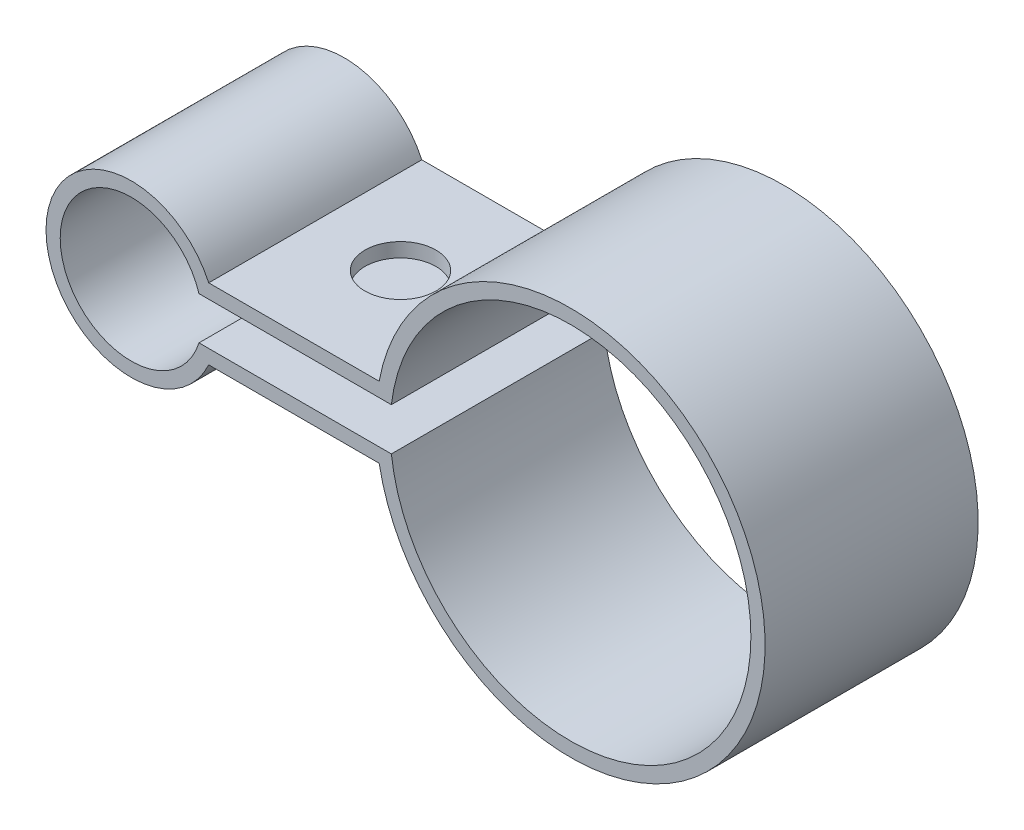
ISO-10303-21;
HEADER;
FILE_DESCRIPTION(('STEP AP214'),'2;1');
FILE_NAME('part.step','',(''),(''),'','','');
FILE_SCHEMA(('AUTOMOTIVE_DESIGN { 1 0 10303 214 1 1 1 1 }'));
ENDSEC;
DATA;
#1=APPLICATION_CONTEXT('core data for automotive mechanical design processes');
#2=APPLICATION_PROTOCOL_DEFINITION('international standard','automotive_design',2000,#1);
#3=PRODUCT_CONTEXT('',#1,'mechanical');
#4=PRODUCT('Part','Part','',(#3));
#5=PRODUCT_RELATED_PRODUCT_CATEGORY('part','',(#4));
#6=PRODUCT_DEFINITION_FORMATION('','',#4);
#7=PRODUCT_DEFINITION_CONTEXT('part definition',#1,'design');
#8=PRODUCT_DEFINITION('design','',#6,#7);
#9=PRODUCT_DEFINITION_SHAPE('','',#8);
#10=(LENGTH_UNIT() NAMED_UNIT(*) SI_UNIT(.MILLI.,.METRE.));
#11=(NAMED_UNIT(*) PLANE_ANGLE_UNIT() SI_UNIT($,.RADIAN.));
#12=(NAMED_UNIT(*) SI_UNIT($,.STERADIAN.) SOLID_ANGLE_UNIT());
#13=UNCERTAINTY_MEASURE_WITH_UNIT(LENGTH_MEASURE(1.E-05),#10,'distance_accuracy_value','');
#14=(GEOMETRIC_REPRESENTATION_CONTEXT(3) GLOBAL_UNCERTAINTY_ASSIGNED_CONTEXT((#13)) GLOBAL_UNIT_ASSIGNED_CONTEXT((#10,
#11,#12)) REPRESENTATION_CONTEXT('',''));
#15=CARTESIAN_POINT('',(0.,0.,0.));
#16=DIRECTION('',(0.,0.,1.));
#17=DIRECTION('',(1.,0.,0.));
#18=AXIS2_PLACEMENT_3D('',#15,#16,#17);
#19=CARTESIAN_POINT('',(0.,0.,15.));
#20=DIRECTION('',(0.,0.,1.));
#21=DIRECTION('',(1.,0.,0.));
#22=AXIS2_PLACEMENT_3D('',#19,#20,#21);
#23=PLANE('',#22);
#24=CARTESIAN_POINT('',(0.,0.,15.));
#25=DIRECTION('',(0.,0.,1.));
#26=DIRECTION('',(1.,0.,0.));
#27=AXIS2_PLACEMENT_3D('',#24,#25,#26);
#28=CIRCLE('',#27,6.);
#29=CARTESIAN_POINT('',(5.45435605731786,2.5,15.));
#30=VERTEX_POINT('',#29);
#31=CARTESIAN_POINT('',(5.45435605731786,-2.5,15.));
#32=VERTEX_POINT('',#31);
#33=EDGE_CURVE('E135',#30,#32,#28,.T.);
#34=ORIENTED_EDGE('',*,*,#33,.T.);
#35=DIRECTION('',(1.,0.,0.));
#36=VECTOR('',#35,1.);
#37=CARTESIAN_POINT('',(5.45435605731786,-2.5,15.));
#38=LINE('',#37,#36);
#39=CARTESIAN_POINT('',(17.4543560573179,-2.5,15.));
#40=VERTEX_POINT('',#39);
#41=EDGE_CURVE('E138',#32,#40,#38,.T.);
#42=ORIENTED_EDGE('',*,*,#41,.T.);
#43=CARTESIAN_POINT('',(30.924322649704,0.,15.));
#44=DIRECTION('',(0.,0.,1.));
#45=DIRECTION('',(1.,0.,0.));
#46=AXIS2_PLACEMENT_3D('',#43,#44,#45);
#47=CIRCLE('',#46,13.7);
#48=CARTESIAN_POINT('',(17.4543560573179,2.5,15.));
#49=VERTEX_POINT('',#48);
#50=EDGE_CURVE('E141',#40,#49,#47,.T.);
#51=ORIENTED_EDGE('',*,*,#50,.T.);
#52=DIRECTION('',(-1.,0.,0.));
#53=VECTOR('',#52,1.);
#54=CARTESIAN_POINT('',(5.45435605731786,2.5,15.));
#55=LINE('',#54,#53);
#56=EDGE_CURVE('E143',#49,#30,#55,.T.);
#57=ORIENTED_EDGE('',*,*,#56,.T.);
#58=EDGE_LOOP('',(#34,#42,#51,#57));
#59=FACE_BOUND('',#58,.T.);
#60=DIRECTION('',(-1.,0.,0.));
#61=VECTOR('',#60,1.);
#62=CARTESIAN_POINT('',(4.76969600708473,1.5,15.));
#63=LINE('',#62,#61);
#64=CARTESIAN_POINT('',(18.3132164333565,1.5,15.));
#65=VERTEX_POINT('',#64);
#66=CARTESIAN_POINT('',(4.76969600708473,1.5,15.));
#67=VERTEX_POINT('',#66);
#68=EDGE_CURVE('E115',#65,#67,#63,.T.);
#69=ORIENTED_EDGE('',*,*,#68,.F.);
#70=CARTESIAN_POINT('',(30.924322649704,0.,15.));
#71=DIRECTION('',(0.,0.,1.));
#72=DIRECTION('',(1.,0.,0.));
#73=AXIS2_PLACEMENT_3D('',#70,#71,#72);
#74=CIRCLE('',#73,12.7);
#75=CARTESIAN_POINT('',(18.3132164333565,-1.5,15.));
#76=VERTEX_POINT('',#75);
#77=EDGE_CURVE('E106',#76,#65,#74,.T.);
#78=ORIENTED_EDGE('',*,*,#77,.F.);
#79=DIRECTION('',(1.,0.,0.));
#80=VECTOR('',#79,1.);
#81=CARTESIAN_POINT('',(9.54145622022061,-1.5,15.));
#82=LINE('',#81,#80);
#83=CARTESIAN_POINT('',(4.76969600708473,-1.5,15.));
#84=VERTEX_POINT('',#83);
#85=EDGE_CURVE('E99',#84,#76,#82,.T.);
#86=ORIENTED_EDGE('',*,*,#85,.F.);
#87=CARTESIAN_POINT('',(0.,0.,15.));
#88=DIRECTION('',(0.,0.,1.));
#89=DIRECTION('',(1.,0.,0.));
#90=AXIS2_PLACEMENT_3D('',#87,#88,#89);
#91=CIRCLE('',#90,5.);
#92=EDGE_CURVE('E117',#67,#84,#91,.T.);
#93=ORIENTED_EDGE('',*,*,#92,.F.);
#94=EDGE_LOOP('',(#69,#78,#86,#93));
#95=FACE_BOUND('',#94,.T.);
#96=ADVANCED_FACE('F34',(#59,#95),#23,.T.);
#97=CARTESIAN_POINT('',(0.,0.,0.));
#98=DIRECTION('',(0.,0.,1.));
#99=DIRECTION('',(1.,0.,0.));
#100=AXIS2_PLACEMENT_3D('',#97,#98,#99);
#101=PLANE('',#100);
#102=CARTESIAN_POINT('',(0.,0.,0.));
#103=DIRECTION('',(0.,0.,1.));
#104=DIRECTION('',(1.,0.,0.));
#105=AXIS2_PLACEMENT_3D('',#102,#103,#104);
#106=CIRCLE('',#105,6.);
#107=CARTESIAN_POINT('',(5.45435605731786,2.5,0.));
#108=VERTEX_POINT('',#107);
#109=CARTESIAN_POINT('',(5.45435605731786,-2.5,0.));
#110=VERTEX_POINT('',#109);
#111=EDGE_CURVE('E111',#108,#110,#106,.T.);
#112=ORIENTED_EDGE('',*,*,#111,.F.);
#113=DIRECTION('',(-1.,0.,0.));
#114=VECTOR('',#113,1.);
#115=CARTESIAN_POINT('',(5.45435605731786,2.5,0.));
#116=LINE('',#115,#114);
#117=CARTESIAN_POINT('',(17.4543560573179,2.5,0.));
#118=VERTEX_POINT('',#117);
#119=EDGE_CURVE('E139',#118,#108,#116,.T.);
#120=ORIENTED_EDGE('',*,*,#119,.F.);
#121=CARTESIAN_POINT('',(30.924322649704,0.,0.));
#122=DIRECTION('',(0.,0.,1.));
#123=DIRECTION('',(1.,0.,0.));
#124=AXIS2_PLACEMENT_3D('',#121,#122,#123);
#125=CIRCLE('',#124,13.7);
#126=CARTESIAN_POINT('',(17.4543560573179,-2.5,0.));
#127=VERTEX_POINT('',#126);
#128=EDGE_CURVE('E150',#127,#118,#125,.T.);
#129=ORIENTED_EDGE('',*,*,#128,.F.);
#130=DIRECTION('',(1.,0.,0.));
#131=VECTOR('',#130,1.);
#132=CARTESIAN_POINT('',(13.5414562202206,-2.5,0.));
#133=LINE('',#132,#131);
#134=EDGE_CURVE('E148',#110,#127,#133,.T.);
#135=ORIENTED_EDGE('',*,*,#134,.F.);
#136=EDGE_LOOP('',(#112,#120,#129,#135));
#137=FACE_BOUND('',#136,.T.);
#138=CARTESIAN_POINT('',(30.924322649704,0.,0.));
#139=DIRECTION('',(0.,0.,1.));
#140=DIRECTION('',(1.,0.,0.));
#141=AXIS2_PLACEMENT_3D('',#138,#139,#140);
#142=CIRCLE('',#141,12.7);
#143=CARTESIAN_POINT('',(18.3132164333565,-1.5,0.));
#144=VERTEX_POINT('',#143);
#145=CARTESIAN_POINT('',(18.3132164333565,1.5,0.));
#146=VERTEX_POINT('',#145);
#147=EDGE_CURVE('E58',#144,#146,#142,.T.);
#148=ORIENTED_EDGE('',*,*,#147,.T.);
#149=DIRECTION('',(-1.,0.,0.));
#150=VECTOR('',#149,1.);
#151=CARTESIAN_POINT('',(4.76969600708473,1.5,0.));
#152=LINE('',#151,#150);
#153=CARTESIAN_POINT('',(4.76969600708473,1.5,0.));
#154=VERTEX_POINT('',#153);
#155=EDGE_CURVE('E123',#146,#154,#152,.T.);
#156=ORIENTED_EDGE('',*,*,#155,.T.);
#157=CARTESIAN_POINT('',(0.,0.,0.));
#158=DIRECTION('',(0.,0.,1.));
#159=DIRECTION('',(1.,0.,0.));
#160=AXIS2_PLACEMENT_3D('',#157,#158,#159);
#161=CIRCLE('',#160,5.);
#162=CARTESIAN_POINT('',(4.76969600708473,-1.5,0.));
#163=VERTEX_POINT('',#162);
#164=EDGE_CURVE('E127',#154,#163,#161,.T.);
#165=ORIENTED_EDGE('',*,*,#164,.T.);
#166=DIRECTION('',(1.,0.,0.));
#167=VECTOR('',#166,1.);
#168=CARTESIAN_POINT('',(4.76969600708473,-1.5,0.));
#169=LINE('',#168,#167);
#170=EDGE_CURVE('E107',#163,#144,#169,.T.);
#171=ORIENTED_EDGE('',*,*,#170,.T.);
#172=EDGE_LOOP('',(#148,#156,#165,#171));
#173=FACE_BOUND('',#172,.T.);
#174=ADVANCED_FACE('F169',(#137,#173),#101,.F.);
#175=CARTESIAN_POINT('',(0.,0.,15.));
#176=DIRECTION('',(0.,0.,-1.));
#177=DIRECTION('',(-1.,0.,0.));
#178=AXIS2_PLACEMENT_3D('',#175,#176,#177);
#179=CYLINDRICAL_SURFACE('',#178,6.);
#180=ORIENTED_EDGE('',*,*,#111,.T.);
#181=DIRECTION('',(0.,0.,-1.));
#182=VECTOR('',#181,1.);
#183=CARTESIAN_POINT('',(5.45435605731786,-2.5,15.));
#184=LINE('',#183,#182);
#185=EDGE_CURVE('E11',#32,#110,#184,.T.);
#186=ORIENTED_EDGE('',*,*,#185,.F.);
#187=ORIENTED_EDGE('',*,*,#33,.F.);
#188=DIRECTION('',(0.,0.,-1.));
#189=VECTOR('',#188,1.);
#190=CARTESIAN_POINT('',(5.45435605731786,2.5,15.));
#191=LINE('',#190,#189);
#192=EDGE_CURVE('E145',#30,#108,#191,.T.);
#193=ORIENTED_EDGE('',*,*,#192,.T.);
#194=EDGE_LOOP('',(#180,#186,#187,#193));
#195=FACE_BOUND('',#194,.T.);
#196=ADVANCED_FACE('F36',(#195),#179,.T.);
#197=CARTESIAN_POINT('',(13.5414562202206,-2.5,15.));
#198=DIRECTION('',(0.,1.,0.));
#199=DIRECTION('',(0.,0.,1.));
#200=AXIS2_PLACEMENT_3D('',#197,#198,#199);
#201=PLANE('',#200);
#202=CARTESIAN_POINT('',(11.4543560573179,-2.5,7.5));
#203=DIRECTION('',(0.,1.,0.));
#204=DIRECTION('',(0.,0.,1.));
#205=AXIS2_PLACEMENT_3D('',#202,#203,#204);
#206=CIRCLE('',#205,2.5);
#207=CARTESIAN_POINT('',(11.4543560573179,-2.5,10.));
#208=VERTEX_POINT('',#207);
#209=EDGE_CURVE('E124',#208,#208,#206,.T.);
#210=ORIENTED_EDGE('',*,*,#209,.T.);
#211=EDGE_LOOP('',(#210));
#212=FACE_BOUND('',#211,.T.);
#213=ORIENTED_EDGE('',*,*,#134,.T.);
#214=DIRECTION('',(0.,0.,-1.));
#215=VECTOR('',#214,1.);
#216=CARTESIAN_POINT('',(17.4543560573179,-2.5,15.));
#217=LINE('',#216,#215);
#218=EDGE_CURVE('E43',#40,#127,#217,.T.);
#219=ORIENTED_EDGE('',*,*,#218,.F.);
#220=ORIENTED_EDGE('',*,*,#41,.F.);
#221=ORIENTED_EDGE('',*,*,#185,.T.);
#222=EDGE_LOOP('',(#213,#219,#220,#221));
#223=FACE_BOUND('',#222,.T.);
#224=ADVANCED_FACE('F179',(#212,#223),#201,.F.);
#225=CARTESIAN_POINT('',(30.924322649704,0.,15.));
#226=DIRECTION('',(0.,0.,-1.));
#227=DIRECTION('',(-1.,0.,0.));
#228=AXIS2_PLACEMENT_3D('',#225,#226,#227);
#229=CYLINDRICAL_SURFACE('',#228,13.7);
#230=ORIENTED_EDGE('',*,*,#128,.T.);
#231=DIRECTION('',(0.,0.,-1.));
#232=VECTOR('',#231,1.);
#233=CARTESIAN_POINT('',(17.4543560573179,2.5,15.));
#234=LINE('',#233,#232);
#235=EDGE_CURVE('E155',#49,#118,#234,.T.);
#236=ORIENTED_EDGE('',*,*,#235,.F.);
#237=ORIENTED_EDGE('',*,*,#50,.F.);
#238=ORIENTED_EDGE('',*,*,#218,.T.);
#239=EDGE_LOOP('',(#230,#236,#237,#238));
#240=FACE_BOUND('',#239,.T.);
#241=ADVANCED_FACE('F163',(#240),#229,.T.);
#242=CARTESIAN_POINT('',(5.45435605731786,2.5,15.));
#243=DIRECTION('',(0.,-1.,0.));
#244=DIRECTION('',(0.,0.,-1.));
#245=AXIS2_PLACEMENT_3D('',#242,#243,#244);
#246=PLANE('',#245);
#247=CARTESIAN_POINT('',(11.4543560573179,2.5,7.5));
#248=DIRECTION('',(0.,1.,0.));
#249=DIRECTION('',(0.,0.,1.));
#250=AXIS2_PLACEMENT_3D('',#247,#248,#249);
#251=CIRCLE('',#250,2.5);
#252=CARTESIAN_POINT('',(11.4543560573179,2.5,10.));
#253=VERTEX_POINT('',#252);
#254=EDGE_CURVE('E205',#253,#253,#251,.T.);
#255=ORIENTED_EDGE('',*,*,#254,.F.);
#256=EDGE_LOOP('',(#255));
#257=FACE_BOUND('',#256,.T.);
#258=ORIENTED_EDGE('',*,*,#119,.T.);
#259=ORIENTED_EDGE('',*,*,#192,.F.);
#260=ORIENTED_EDGE('',*,*,#56,.F.);
#261=ORIENTED_EDGE('',*,*,#235,.T.);
#262=EDGE_LOOP('',(#258,#259,#260,#261));
#263=FACE_BOUND('',#262,.T.);
#264=ADVANCED_FACE('F173',(#257,#263),#246,.F.);
#265=CARTESIAN_POINT('',(30.924322649704,0.,15.));
#266=DIRECTION('',(0.,0.,-1.));
#267=DIRECTION('',(-1.,0.,0.));
#268=AXIS2_PLACEMENT_3D('',#265,#266,#267);
#269=CYLINDRICAL_SURFACE('',#268,12.7);
#270=ORIENTED_EDGE('',*,*,#147,.F.);
#271=DIRECTION('',(0.,0.,-1.));
#272=VECTOR('',#271,1.);
#273=CARTESIAN_POINT('',(18.3132164333565,-1.5,15.));
#274=LINE('',#273,#272);
#275=EDGE_CURVE('E101',#76,#144,#274,.T.);
#276=ORIENTED_EDGE('',*,*,#275,.F.);
#277=ORIENTED_EDGE('',*,*,#77,.T.);
#278=DIRECTION('',(0.,0.,-1.));
#279=VECTOR('',#278,1.);
#280=CARTESIAN_POINT('',(18.3132164333565,1.5,15.));
#281=LINE('',#280,#279);
#282=EDGE_CURVE('E112',#65,#146,#281,.T.);
#283=ORIENTED_EDGE('',*,*,#282,.T.);
#284=EDGE_LOOP('',(#270,#276,#277,#283));
#285=FACE_BOUND('',#284,.T.);
#286=ADVANCED_FACE('F109',(#285),#269,.F.);
#287=CARTESIAN_POINT('',(4.76969600708473,1.5,15.));
#288=DIRECTION('',(0.,-1.,0.));
#289=DIRECTION('',(1.,0.,0.));
#290=AXIS2_PLACEMENT_3D('',#287,#288,#289);
#291=PLANE('',#290);
#292=CARTESIAN_POINT('',(11.4543560573179,1.5,7.5));
#293=DIRECTION('',(0.,-1.,0.));
#294=DIRECTION('',(1.,0.,0.));
#295=AXIS2_PLACEMENT_3D('',#292,#293,#294);
#296=CIRCLE('',#295,2.5);
#297=CARTESIAN_POINT('',(13.9543560573179,1.5,7.5));
#298=VERTEX_POINT('',#297);
#299=EDGE_CURVE('E209',#298,#298,#296,.T.);
#300=ORIENTED_EDGE('',*,*,#299,.F.);
#301=EDGE_LOOP('',(#300));
#302=FACE_BOUND('',#301,.T.);
#303=ORIENTED_EDGE('',*,*,#155,.F.);
#304=ORIENTED_EDGE('',*,*,#282,.F.);
#305=ORIENTED_EDGE('',*,*,#68,.T.);
#306=DIRECTION('',(0.,0.,-1.));
#307=VECTOR('',#306,1.);
#308=CARTESIAN_POINT('',(4.76969600708473,1.5,15.));
#309=LINE('',#308,#307);
#310=EDGE_CURVE('E132',#67,#154,#309,.T.);
#311=ORIENTED_EDGE('',*,*,#310,.T.);
#312=EDGE_LOOP('',(#303,#304,#305,#311));
#313=FACE_BOUND('',#312,.T.);
#314=ADVANCED_FACE('F202',(#302,#313),#291,.T.);
#315=CARTESIAN_POINT('',(0.,0.,15.));
#316=DIRECTION('',(0.,0.,-1.));
#317=DIRECTION('',(-1.,0.,0.));
#318=AXIS2_PLACEMENT_3D('',#315,#316,#317);
#319=CYLINDRICAL_SURFACE('',#318,5.);
#320=ORIENTED_EDGE('',*,*,#164,.F.);
#321=ORIENTED_EDGE('',*,*,#310,.F.);
#322=ORIENTED_EDGE('',*,*,#92,.T.);
#323=DIRECTION('',(0.,0.,-1.));
#324=VECTOR('',#323,1.);
#325=CARTESIAN_POINT('',(4.76969600708473,-1.5,15.));
#326=LINE('',#325,#324);
#327=EDGE_CURVE('E50',#84,#163,#326,.T.);
#328=ORIENTED_EDGE('',*,*,#327,.T.);
#329=EDGE_LOOP('',(#320,#321,#322,#328));
#330=FACE_BOUND('',#329,.T.);
#331=ADVANCED_FACE('F224',(#330),#319,.F.);
#332=CARTESIAN_POINT('',(4.76969600708473,-1.5,15.));
#333=DIRECTION('',(0.,1.,0.));
#334=DIRECTION('',(-1.,0.,0.));
#335=AXIS2_PLACEMENT_3D('',#332,#333,#334);
#336=PLANE('',#335);
#337=CARTESIAN_POINT('',(11.4543560573179,-1.5,7.5));
#338=DIRECTION('',(0.,1.,0.));
#339=DIRECTION('',(-1.,0.,0.));
#340=AXIS2_PLACEMENT_3D('',#337,#338,#339);
#341=CIRCLE('',#340,2.5);
#342=CARTESIAN_POINT('',(8.95435605731786,-1.5,7.5));
#343=VERTEX_POINT('',#342);
#344=EDGE_CURVE('E38',#343,#343,#341,.T.);
#345=ORIENTED_EDGE('',*,*,#344,.F.);
#346=EDGE_LOOP('',(#345));
#347=FACE_BOUND('',#346,.T.);
#348=ORIENTED_EDGE('',*,*,#170,.F.);
#349=ORIENTED_EDGE('',*,*,#327,.F.);
#350=ORIENTED_EDGE('',*,*,#85,.T.);
#351=ORIENTED_EDGE('',*,*,#275,.T.);
#352=EDGE_LOOP('',(#348,#349,#350,#351));
#353=FACE_BOUND('',#352,.T.);
#354=ADVANCED_FACE('F100',(#347,#353),#336,.T.);
#355=CARTESIAN_POINT('',(11.4543560573179,-12.5,7.5));
#356=DIRECTION('',(0.,1.,0.));
#357=DIRECTION('',(0.,0.,1.));
#358=AXIS2_PLACEMENT_3D('',#355,#356,#357);
#359=CYLINDRICAL_SURFACE('',#358,2.5);
#360=ORIENTED_EDGE('',*,*,#344,.T.);
#361=EDGE_LOOP('',(#360));
#362=FACE_BOUND('',#361,.T.);
#363=ORIENTED_EDGE('',*,*,#209,.F.);
#364=EDGE_LOOP('',(#363));
#365=FACE_BOUND('',#364,.T.);
#366=ADVANCED_FACE('F214',(#362,#365),#359,.F.);
#367=ORIENTED_EDGE('',*,*,#299,.T.);
#368=EDGE_LOOP('',(#367));
#369=FACE_BOUND('',#368,.T.);
#370=ORIENTED_EDGE('',*,*,#254,.T.);
#371=EDGE_LOOP('',(#370));
#372=FACE_BOUND('',#371,.T.);
#373=ADVANCED_FACE('F216',(#369,#372),#359,.F.);
#374=CLOSED_SHELL('',(#96,#174,#196,#224,#241,#264,#286,#314,#331,#354,#366,#373));
#375=MANIFOLD_SOLID_BREP('B2',#374);
#376=ADVANCED_BREP_SHAPE_REPRESENTATION('',(#18,#375),#14);
#377=SHAPE_DEFINITION_REPRESENTATION(#9,#376);
ENDSEC;
END-ISO-10303-21;
